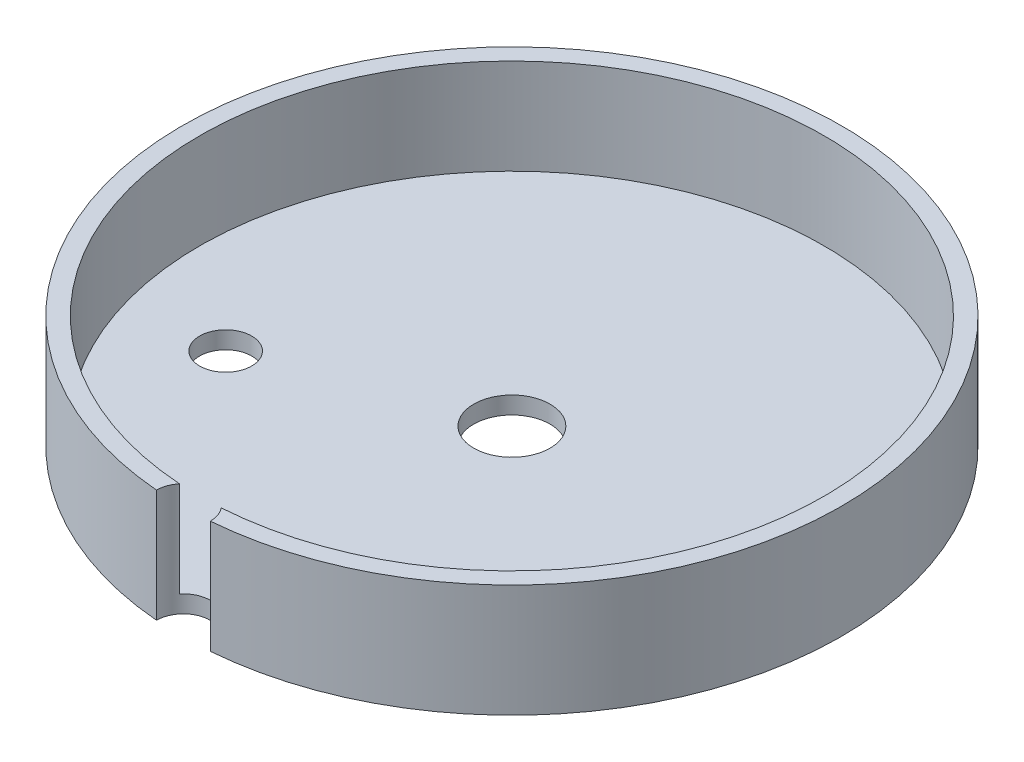
ISO-10303-21;
HEADER;
FILE_DESCRIPTION(('STEP AP214'),'2;1');
FILE_NAME('part.step','',(''),(''),'','','');
FILE_SCHEMA(('AUTOMOTIVE_DESIGN { 1 0 10303 214 1 1 1 1 }'));
ENDSEC;
DATA;
#1=APPLICATION_CONTEXT('core data for automotive mechanical design processes');
#2=APPLICATION_PROTOCOL_DEFINITION('international standard','automotive_design',2000,#1);
#3=PRODUCT_CONTEXT('',#1,'mechanical');
#4=PRODUCT('Part','Part','',(#3));
#5=PRODUCT_RELATED_PRODUCT_CATEGORY('part','',(#4));
#6=PRODUCT_DEFINITION_FORMATION('','',#4);
#7=PRODUCT_DEFINITION_CONTEXT('part definition',#1,'design');
#8=PRODUCT_DEFINITION('design','',#6,#7);
#9=PRODUCT_DEFINITION_SHAPE('','',#8);
#10=(LENGTH_UNIT() NAMED_UNIT(*) SI_UNIT(.MILLI.,.METRE.));
#11=(NAMED_UNIT(*) PLANE_ANGLE_UNIT() SI_UNIT($,.RADIAN.));
#12=(NAMED_UNIT(*) SI_UNIT($,.STERADIAN.) SOLID_ANGLE_UNIT());
#13=UNCERTAINTY_MEASURE_WITH_UNIT(LENGTH_MEASURE(1.E-05),#10,'distance_accuracy_value','');
#14=(GEOMETRIC_REPRESENTATION_CONTEXT(3) GLOBAL_UNCERTAINTY_ASSIGNED_CONTEXT((#13)) GLOBAL_UNIT_ASSIGNED_CONTEXT((#10,
#11,#12)) REPRESENTATION_CONTEXT('',''));
#15=CARTESIAN_POINT('',(0.,0.,0.));
#16=DIRECTION('',(0.,0.,1.));
#17=DIRECTION('',(1.,0.,0.));
#18=AXIS2_PLACEMENT_3D('',#15,#16,#17);
#19=CARTESIAN_POINT('',(0.,20.32,48.0991437657678));
#20=DIRECTION('',(0.,-1.,0.));
#21=DIRECTION('',(0.,0.,-1.));
#22=AXIS2_PLACEMENT_3D('',#19,#20,#21);
#23=CYLINDRICAL_SURFACE('',#22,3.937);
#24=CARTESIAN_POINT('',(0.,16.51,48.0991437657678));
#25=DIRECTION('',(0.,1.,0.));
#26=DIRECTION('',(0.,0.,1.));
#27=AXIS2_PLACEMENT_3D('',#24,#25,#26);
#28=CIRCLE('',#27,3.937);
#29=CARTESIAN_POINT('',(-3.937,16.51,48.0991437657678));
#30=VERTEX_POINT('',#29);
#31=CARTESIAN_POINT('',(-3.05654709958745,16.51,45.617714978153));
#32=VERTEX_POINT('',#31);
#33=EDGE_CURVE('E48',#30,#32,#28,.F.);
#34=ORIENTED_EDGE('',*,*,#33,.F.);
#35=DIRECTION('',(0.,-1.,0.));
#36=VECTOR('',#35,1.);
#37=CARTESIAN_POINT('',(-3.937,20.32,48.0991437657678));
#38=LINE('',#37,#36);
#39=CARTESIAN_POINT('',(-3.937,0.,48.0991437657678));
#40=VERTEX_POINT('',#39);
#41=EDGE_CURVE('E104',#30,#40,#38,.T.);
#42=ORIENTED_EDGE('',*,*,#41,.T.);
#43=CARTESIAN_POINT('',(0.,0.,48.0991437657678));
#44=DIRECTION('',(0.,-1.,0.));
#45=DIRECTION('',(0.,0.,1.));
#46=AXIS2_PLACEMENT_3D('',#43,#44,#45);
#47=CIRCLE('',#46,3.937);
#48=CARTESIAN_POINT('',(3.937,0.,48.0991437657678));
#49=VERTEX_POINT('',#48);
#50=EDGE_CURVE('E93',#40,#49,#47,.T.);
#51=ORIENTED_EDGE('',*,*,#50,.T.);
#52=DIRECTION('',(0.,-1.,0.));
#53=VECTOR('',#52,1.);
#54=CARTESIAN_POINT('',(3.937,20.32,48.0991437657678));
#55=LINE('',#54,#53);
#56=CARTESIAN_POINT('',(3.937,16.51,48.0991437657678));
#57=VERTEX_POINT('',#56);
#58=EDGE_CURVE('E89',#57,#49,#55,.T.);
#59=ORIENTED_EDGE('',*,*,#58,.F.);
#60=CARTESIAN_POINT('',(3.05654709958746,16.51,45.617714978153));
#61=VERTEX_POINT('',#60);
#62=EDGE_CURVE('E11',#61,#57,#28,.F.);
#63=ORIENTED_EDGE('',*,*,#62,.F.);
#64=DIRECTION('',(0.,1.,0.));
#65=VECTOR('',#64,1.);
#66=CARTESIAN_POINT('',(3.05654709958745,10.16,45.617714978153));
#67=LINE('',#66,#65);
#68=CARTESIAN_POINT('',(3.05654709958748,2.54,45.617714978153));
#69=VERTEX_POINT('',#68);
#70=EDGE_CURVE('E84',#61,#69,#67,.F.);
#71=ORIENTED_EDGE('',*,*,#70,.T.);
#72=CARTESIAN_POINT('',(0.,2.54,48.0991437657678));
#73=DIRECTION('',(0.,1.,0.));
#74=DIRECTION('',(0.,0.,1.));
#75=AXIS2_PLACEMENT_3D('',#72,#73,#74);
#76=CIRCLE('',#75,3.937);
#77=CARTESIAN_POINT('',(-3.05654709958748,2.54,45.617714978153));
#78=VERTEX_POINT('',#77);
#79=EDGE_CURVE('E88',#78,#69,#76,.F.);
#80=ORIENTED_EDGE('',*,*,#79,.F.);
#81=DIRECTION('',(0.,1.,0.));
#82=VECTOR('',#81,1.);
#83=CARTESIAN_POINT('',(-3.05654709958745,10.16,45.617714978153));
#84=LINE('',#83,#82);
#85=EDGE_CURVE('E82',#78,#32,#84,.T.);
#86=ORIENTED_EDGE('',*,*,#85,.T.);
#87=EDGE_LOOP('',(#34,#42,#51,#59,#63,#71,#80,#86));
#88=FACE_BOUND('',#87,.T.);
#89=ADVANCED_FACE('F37',(#88),#23,.F.);
#90=CARTESIAN_POINT('',(0.,20.32,0.));
#91=DIRECTION('',(0.,-1.,0.));
#92=DIRECTION('',(0.,0.,-1.));
#93=AXIS2_PLACEMENT_3D('',#90,#91,#92);
#94=CYLINDRICAL_SURFACE('',#93,48.26);
#95=CARTESIAN_POINT('',(0.,16.51,0.));
#96=DIRECTION('',(0.,1.,0.));
#97=DIRECTION('',(0.,0.,1.));
#98=AXIS2_PLACEMENT_3D('',#95,#96,#97);
#99=CIRCLE('',#98,48.26);
#100=EDGE_CURVE('E74',#57,#30,#99,.T.);
#101=ORIENTED_EDGE('',*,*,#100,.F.);
#102=ORIENTED_EDGE('',*,*,#58,.T.);
#103=CARTESIAN_POINT('',(0.,0.,0.));
#104=DIRECTION('',(0.,1.,0.));
#105=DIRECTION('',(0.,0.,1.));
#106=AXIS2_PLACEMENT_3D('',#103,#104,#105);
#107=CIRCLE('',#106,48.26);
#108=EDGE_CURVE('E91',#49,#40,#107,.T.);
#109=ORIENTED_EDGE('',*,*,#108,.T.);
#110=ORIENTED_EDGE('',*,*,#41,.F.);
#111=EDGE_LOOP('',(#101,#102,#109,#110));
#112=FACE_BOUND('',#111,.T.);
#113=ADVANCED_FACE('F150',(#112),#94,.T.);
#114=CARTESIAN_POINT('',(0.,2.54,0.));
#115=DIRECTION('',(0.,1.,0.));
#116=DIRECTION('',(0.,0.,1.));
#117=AXIS2_PLACEMENT_3D('',#114,#115,#116);
#118=CYLINDRICAL_SURFACE('',#117,45.72);
#119=CARTESIAN_POINT('',(0.,16.51,0.));
#120=DIRECTION('',(0.,1.,0.));
#121=DIRECTION('',(0.,0.,1.));
#122=AXIS2_PLACEMENT_3D('',#119,#120,#121);
#123=CIRCLE('',#122,45.72);
#124=EDGE_CURVE('E46',#32,#61,#123,.F.);
#125=ORIENTED_EDGE('',*,*,#124,.F.);
#126=ORIENTED_EDGE('',*,*,#85,.F.);
#127=CARTESIAN_POINT('',(0.,2.54,0.));
#128=DIRECTION('',(0.,1.,0.));
#129=DIRECTION('',(0.,0.,1.));
#130=AXIS2_PLACEMENT_3D('',#127,#128,#129);
#131=CIRCLE('',#130,45.72);
#132=EDGE_CURVE('E108',#69,#78,#131,.T.);
#133=ORIENTED_EDGE('',*,*,#132,.F.);
#134=ORIENTED_EDGE('',*,*,#70,.F.);
#135=EDGE_LOOP('',(#125,#126,#133,#134));
#136=FACE_BOUND('',#135,.T.);
#137=ADVANCED_FACE('F80',(#136),#118,.F.);
#138=CARTESIAN_POINT('',(0.,20.32,0.));
#139=DIRECTION('',(0.,-1.,0.));
#140=DIRECTION('',(0.,0.,-1.));
#141=AXIS2_PLACEMENT_3D('',#138,#139,#140);
#142=CYLINDRICAL_SURFACE('',#141,5.588);
#143=CARTESIAN_POINT('',(0.,0.,0.));
#144=DIRECTION('',(0.,1.,0.));
#145=DIRECTION('',(0.,0.,1.));
#146=AXIS2_PLACEMENT_3D('',#143,#144,#145);
#147=CIRCLE('',#146,5.588);
#148=CARTESIAN_POINT('',(0.,0.,5.588));
#149=VERTEX_POINT('',#148);
#150=EDGE_CURVE('E99',#149,#149,#147,.T.);
#151=ORIENTED_EDGE('',*,*,#150,.F.);
#152=EDGE_LOOP('',(#151));
#153=FACE_BOUND('',#152,.T.);
#154=CARTESIAN_POINT('',(0.,2.54,0.));
#155=DIRECTION('',(0.,1.,0.));
#156=DIRECTION('',(0.,0.,1.));
#157=AXIS2_PLACEMENT_3D('',#154,#155,#156);
#158=CIRCLE('',#157,5.588);
#159=CARTESIAN_POINT('',(0.,2.54,5.588));
#160=VERTEX_POINT('',#159);
#161=EDGE_CURVE('E96',#160,#160,#158,.T.);
#162=ORIENTED_EDGE('',*,*,#161,.T.);
#163=EDGE_LOOP('',(#162));
#164=FACE_BOUND('',#163,.T.);
#165=ADVANCED_FACE('F158',(#153,#164),#142,.F.);
#166=CARTESIAN_POINT('',(0.,0.,24.0495718828839));
#167=DIRECTION('',(0.,1.,0.));
#168=DIRECTION('',(0.,0.,1.));
#169=AXIS2_PLACEMENT_3D('',#166,#167,#168);
#170=PLANE('',#169);
#171=CARTESIAN_POINT('',(-30.48,0.,11.43));
#172=DIRECTION('',(0.,1.,0.));
#173=DIRECTION('',(0.,0.,1.));
#174=AXIS2_PLACEMENT_3D('',#171,#172,#173);
#175=CIRCLE('',#174,3.81);
#176=CARTESIAN_POINT('',(-30.48,0.,15.24));
#177=VERTEX_POINT('',#176);
#178=EDGE_CURVE('E113',#177,#177,#175,.T.);
#179=ORIENTED_EDGE('',*,*,#178,.T.);
#180=EDGE_LOOP('',(#179));
#181=FACE_BOUND('',#180,.T.);
#182=CARTESIAN_POINT('',(30.48,0.,11.43));
#183=DIRECTION('',(0.,1.,0.));
#184=DIRECTION('',(0.,0.,-1.));
#185=AXIS2_PLACEMENT_3D('',#182,#183,#184);
#186=CIRCLE('',#185,3.81);
#187=CARTESIAN_POINT('',(30.48,0.,7.62));
#188=VERTEX_POINT('',#187);
#189=EDGE_CURVE('E118',#188,#188,#186,.T.);
#190=ORIENTED_EDGE('',*,*,#189,.T.);
#191=EDGE_LOOP('',(#190));
#192=FACE_BOUND('',#191,.T.);
#193=ORIENTED_EDGE('',*,*,#50,.F.);
#194=ORIENTED_EDGE('',*,*,#108,.F.);
#195=EDGE_LOOP('',(#193,#194));
#196=FACE_BOUND('',#195,.T.);
#197=ORIENTED_EDGE('',*,*,#150,.T.);
#198=EDGE_LOOP('',(#197));
#199=FACE_BOUND('',#198,.T.);
#200=ADVANCED_FACE('F126',(#181,#192,#196,#199),#170,.F.);
#201=CARTESIAN_POINT('',(0.,2.54,0.));
#202=DIRECTION('',(0.,1.,0.));
#203=DIRECTION('',(0.,0.,1.));
#204=AXIS2_PLACEMENT_3D('',#201,#202,#203);
#205=PLANE('',#204);
#206=CARTESIAN_POINT('',(-30.48,2.54,11.43));
#207=DIRECTION('',(0.,1.,0.));
#208=DIRECTION('',(0.,0.,1.));
#209=AXIS2_PLACEMENT_3D('',#206,#207,#208);
#210=CIRCLE('',#209,3.81);
#211=CARTESIAN_POINT('',(-30.48,2.54,15.24));
#212=VERTEX_POINT('',#211);
#213=EDGE_CURVE('E40',#212,#212,#210,.F.);
#214=ORIENTED_EDGE('',*,*,#213,.T.);
#215=EDGE_LOOP('',(#214));
#216=FACE_BOUND('',#215,.T.);
#217=CARTESIAN_POINT('',(30.48,2.54,11.43));
#218=DIRECTION('',(0.,1.,0.));
#219=DIRECTION('',(0.,0.,1.));
#220=AXIS2_PLACEMENT_3D('',#217,#218,#219);
#221=CIRCLE('',#220,3.81);
#222=CARTESIAN_POINT('',(30.48,2.54,15.24));
#223=VERTEX_POINT('',#222);
#224=EDGE_CURVE('E111',#223,#223,#221,.F.);
#225=ORIENTED_EDGE('',*,*,#224,.T.);
#226=EDGE_LOOP('',(#225));
#227=FACE_BOUND('',#226,.T.);
#228=ORIENTED_EDGE('',*,*,#161,.F.);
#229=EDGE_LOOP('',(#228));
#230=FACE_BOUND('',#229,.T.);
#231=ORIENTED_EDGE('',*,*,#79,.T.);
#232=ORIENTED_EDGE('',*,*,#132,.T.);
#233=EDGE_LOOP('',(#231,#232));
#234=FACE_BOUND('',#233,.T.);
#235=ADVANCED_FACE('F132',(#216,#227,#230,#234),#205,.T.);
#236=CARTESIAN_POINT('',(30.48,39.37,11.43));
#237=DIRECTION('',(0.,-1.,0.));
#238=DIRECTION('',(0.,0.,-1.));
#239=AXIS2_PLACEMENT_3D('',#236,#237,#238);
#240=CYLINDRICAL_SURFACE('',#239,3.81);
#241=ORIENTED_EDGE('',*,*,#224,.F.);
#242=EDGE_LOOP('',(#241));
#243=FACE_BOUND('',#242,.T.);
#244=ORIENTED_EDGE('',*,*,#189,.F.);
#245=EDGE_LOOP('',(#244));
#246=FACE_BOUND('',#245,.T.);
#247=ADVANCED_FACE('F129',(#243,#246),#240,.F.);
#248=CARTESIAN_POINT('',(-30.48,39.37,11.43));
#249=DIRECTION('',(0.,-1.,0.));
#250=DIRECTION('',(0.,0.,-1.));
#251=AXIS2_PLACEMENT_3D('',#248,#249,#250);
#252=CYLINDRICAL_SURFACE('',#251,3.81);
#253=ORIENTED_EDGE('',*,*,#213,.F.);
#254=EDGE_LOOP('',(#253));
#255=FACE_BOUND('',#254,.T.);
#256=ORIENTED_EDGE('',*,*,#178,.F.);
#257=EDGE_LOOP('',(#256));
#258=FACE_BOUND('',#257,.T.);
#259=ADVANCED_FACE('F131',(#255,#258),#252,.F.);
#260=CARTESIAN_POINT('',(72.898,16.51,-55.7376732664433));
#261=DIRECTION('',(0.,1.,0.));
#262=DIRECTION('',(0.,0.,1.));
#263=AXIS2_PLACEMENT_3D('',#260,#261,#262);
#264=PLANE('',#263);
#265=ORIENTED_EDGE('',*,*,#100,.T.);
#266=ORIENTED_EDGE('',*,*,#33,.T.);
#267=ORIENTED_EDGE('',*,*,#124,.T.);
#268=ORIENTED_EDGE('',*,*,#62,.T.);
#269=EDGE_LOOP('',(#265,#266,#267,#268));
#270=FACE_BOUND('',#269,.T.);
#271=ADVANCED_FACE('F73',(#270),#264,.T.);
#272=CLOSED_SHELL('',(#89,#113,#137,#165,#200,#235,#247,#259,#271));
#273=MANIFOLD_SOLID_BREP('B2',#272);
#274=ADVANCED_BREP_SHAPE_REPRESENTATION('',(#18,#273),#14);
#275=SHAPE_DEFINITION_REPRESENTATION(#9,#274);
ENDSEC;
END-ISO-10303-21;
